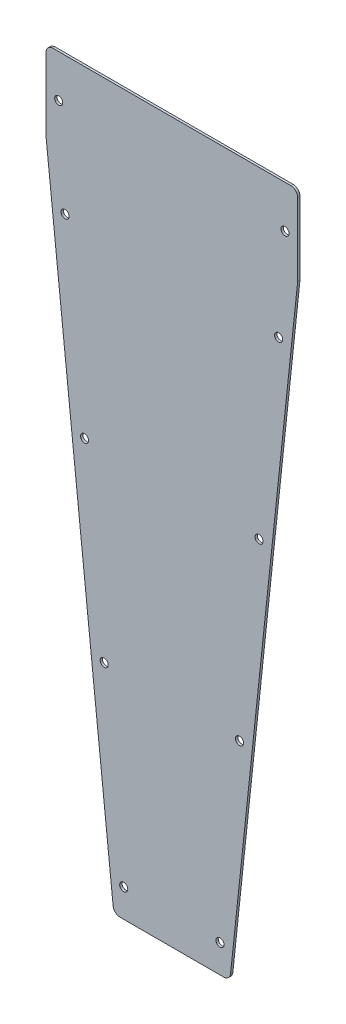
ISO-10303-21;
HEADER;
FILE_DESCRIPTION(('STEP AP214'),'2;1');
FILE_NAME('part.step','',(''),(''),'','','');
FILE_SCHEMA(('AUTOMOTIVE_DESIGN { 1 0 10303 214 1 1 1 1 }'));
ENDSEC;
DATA;
#1=APPLICATION_CONTEXT('core data for automotive mechanical design processes');
#2=APPLICATION_PROTOCOL_DEFINITION('international standard','automotive_design',2000,#1);
#3=PRODUCT_CONTEXT('',#1,'mechanical');
#4=PRODUCT('Part','Part','',(#3));
#5=PRODUCT_RELATED_PRODUCT_CATEGORY('part','',(#4));
#6=PRODUCT_DEFINITION_FORMATION('','',#4);
#7=PRODUCT_DEFINITION_CONTEXT('part definition',#1,'design');
#8=PRODUCT_DEFINITION('design','',#6,#7);
#9=PRODUCT_DEFINITION_SHAPE('','',#8);
#10=(LENGTH_UNIT() NAMED_UNIT(*) SI_UNIT(.MILLI.,.METRE.));
#11=(NAMED_UNIT(*) PLANE_ANGLE_UNIT() SI_UNIT($,.RADIAN.));
#12=(NAMED_UNIT(*) SI_UNIT($,.STERADIAN.) SOLID_ANGLE_UNIT());
#13=UNCERTAINTY_MEASURE_WITH_UNIT(LENGTH_MEASURE(1.E-05),#10,'distance_accuracy_value','');
#14=(GEOMETRIC_REPRESENTATION_CONTEXT(3) GLOBAL_UNCERTAINTY_ASSIGNED_CONTEXT((#13)) GLOBAL_UNIT_ASSIGNED_CONTEXT((#10,
#11,#12)) REPRESENTATION_CONTEXT('',''));
#15=CARTESIAN_POINT('',(0.,0.,0.));
#16=DIRECTION('',(0.,0.,1.));
#17=DIRECTION('',(1.,0.,0.));
#18=AXIS2_PLACEMENT_3D('',#15,#16,#17);
#19=CARTESIAN_POINT('',(109.,553.95,-2.));
#20=DIRECTION('',(1.,0.,0.));
#21=DIRECTION('',(0.,0.,-1.));
#22=AXIS2_PLACEMENT_3D('',#19,#20,#21);
#23=PLANE('',#22);
#24=DIRECTION('',(0.,1.,0.));
#25=VECTOR('',#24,1.);
#26=CARTESIAN_POINT('',(109.,553.95,0.));
#27=LINE('',#26,#25);
#28=CARTESIAN_POINT('',(109.,553.95,0.));
#29=VERTEX_POINT('',#28);
#30=CARTESIAN_POINT('',(109.,616.76,0.));
#31=VERTEX_POINT('',#30);
#32=EDGE_CURVE('E150',#29,#31,#27,.T.);
#33=ORIENTED_EDGE('',*,*,#32,.F.);
#34=DIRECTION('',(0.,0.,1.));
#35=VECTOR('',#34,1.);
#36=CARTESIAN_POINT('',(109.,553.95,-2.));
#37=LINE('',#36,#35);
#38=CARTESIAN_POINT('',(109.,553.95,-2.));
#39=VERTEX_POINT('',#38);
#40=EDGE_CURVE('E11',#39,#29,#37,.T.);
#41=ORIENTED_EDGE('',*,*,#40,.F.);
#42=DIRECTION('',(0.,1.,0.));
#43=VECTOR('',#42,1.);
#44=CARTESIAN_POINT('',(109.,553.95,-2.));
#45=LINE('',#44,#43);
#46=CARTESIAN_POINT('',(109.,616.76,-2.));
#47=VERTEX_POINT('',#46);
#48=EDGE_CURVE('E177',#39,#47,#45,.T.);
#49=ORIENTED_EDGE('',*,*,#48,.T.);
#50=DIRECTION('',(0.,0.,1.));
#51=VECTOR('',#50,1.);
#52=CARTESIAN_POINT('',(109.,616.76,-2.));
#53=LINE('',#52,#51);
#54=EDGE_CURVE('E44',#47,#31,#53,.T.);
#55=ORIENTED_EDGE('',*,*,#54,.T.);
#56=EDGE_LOOP('',(#33,#41,#49,#55));
#57=FACE_BOUND('',#56,.T.);
#58=ADVANCED_FACE('F41',(#57),#23,.T.);
#59=CARTESIAN_POINT('',(50.8415635198265,5.36744979339561,-2.));
#60=DIRECTION('',(0.994427253304421,-0.105425034434065,0.));
#61=DIRECTION('',(0.105425034434065,0.994427253304421,0.));
#62=AXIS2_PLACEMENT_3D('',#59,#60,#61);
#63=PLANE('',#62);
#64=DIRECTION('',(0.105425034434065,0.994427253304421,0.));
#65=VECTOR('',#64,1.);
#66=CARTESIAN_POINT('',(50.8415635198265,5.36744979339561,0.));
#67=LINE('',#66,#65);
#68=CARTESIAN_POINT('',(50.8415635198265,5.36744979339561,0.));
#69=VERTEX_POINT('',#68);
#70=EDGE_CURVE('E175',#69,#29,#67,.T.);
#71=ORIENTED_EDGE('',*,*,#70,.F.);
#72=DIRECTION('',(0.,0.,1.));
#73=VECTOR('',#72,1.);
#74=CARTESIAN_POINT('',(50.8415635198265,5.36744979339561,-2.));
#75=LINE('',#74,#73);
#76=CARTESIAN_POINT('',(50.8415635198265,5.36744979339561,-2.));
#77=VERTEX_POINT('',#76);
#78=EDGE_CURVE('E50',#77,#69,#75,.T.);
#79=ORIENTED_EDGE('',*,*,#78,.F.);
#80=DIRECTION('',(0.105425034434065,0.994427253304421,0.));
#81=VECTOR('',#80,1.);
#82=CARTESIAN_POINT('',(50.8415635198265,5.36744979339561,-2.));
#83=LINE('',#82,#81);
#84=EDGE_CURVE('E140',#77,#39,#83,.T.);
#85=ORIENTED_EDGE('',*,*,#84,.T.);
#86=ORIENTED_EDGE('',*,*,#40,.T.);
#87=EDGE_LOOP('',(#71,#79,#85,#86));
#88=FACE_BOUND('',#87,.T.);
#89=ADVANCED_FACE('F193',(#88),#63,.T.);
#90=CARTESIAN_POINT('',(44.8749999999999,5.99999999999994,-2.));
#91=DIRECTION('',(0.,0.,1.));
#92=DIRECTION('',(1.,0.,0.));
#93=AXIS2_PLACEMENT_3D('',#90,#91,#92);
#94=CYLINDRICAL_SURFACE('',#93,6.);
#95=CARTESIAN_POINT('',(44.8749999999999,5.99999999999994,0.));
#96=DIRECTION('',(0.,0.,1.));
#97=DIRECTION('',(1.,0.,0.));
#98=AXIS2_PLACEMENT_3D('',#95,#96,#97);
#99=CIRCLE('',#98,6.);
#100=CARTESIAN_POINT('',(44.8749999999999,0.,0.));
#101=VERTEX_POINT('',#100);
#102=EDGE_CURVE('E127',#101,#69,#99,.T.);
#103=ORIENTED_EDGE('',*,*,#102,.F.);
#104=DIRECTION('',(0.,0.,1.));
#105=VECTOR('',#104,1.);
#106=CARTESIAN_POINT('',(44.8749999999999,0.,-2.));
#107=LINE('',#106,#105);
#108=CARTESIAN_POINT('',(44.8749999999999,0.,-2.));
#109=VERTEX_POINT('',#108);
#110=EDGE_CURVE('E122',#109,#101,#107,.T.);
#111=ORIENTED_EDGE('',*,*,#110,.F.);
#112=CARTESIAN_POINT('',(44.8749999999999,5.99999999999994,-2.));
#113=DIRECTION('',(0.,0.,1.));
#114=DIRECTION('',(1.,0.,0.));
#115=AXIS2_PLACEMENT_3D('',#112,#113,#114);
#116=CIRCLE('',#115,6.);
#117=EDGE_CURVE('E125',#109,#77,#116,.T.);
#118=ORIENTED_EDGE('',*,*,#117,.T.);
#119=ORIENTED_EDGE('',*,*,#78,.T.);
#120=EDGE_LOOP('',(#103,#111,#118,#119));
#121=FACE_BOUND('',#120,.T.);
#122=ADVANCED_FACE('F124',(#121),#94,.T.);
#123=CARTESIAN_POINT('',(-44.8750000000001,0.,-2.));
#124=DIRECTION('',(0.,-1.,0.));
#125=DIRECTION('',(0.,0.,-1.));
#126=AXIS2_PLACEMENT_3D('',#123,#124,#125);
#127=PLANE('',#126);
#128=DIRECTION('',(1.,0.,0.));
#129=VECTOR('',#128,1.);
#130=CARTESIAN_POINT('',(-44.8750000000001,0.,0.));
#131=LINE('',#130,#129);
#132=CARTESIAN_POINT('',(-44.8750000000001,0.,0.));
#133=VERTEX_POINT('',#132);
#134=EDGE_CURVE('E172',#133,#101,#131,.T.);
#135=ORIENTED_EDGE('',*,*,#134,.F.);
#136=DIRECTION('',(0.,0.,1.));
#137=VECTOR('',#136,1.);
#138=CARTESIAN_POINT('',(-44.8750000000001,0.,-2.));
#139=LINE('',#138,#137);
#140=CARTESIAN_POINT('',(-44.8750000000001,0.,-2.));
#141=VERTEX_POINT('',#140);
#142=EDGE_CURVE('E132',#141,#133,#139,.T.);
#143=ORIENTED_EDGE('',*,*,#142,.F.);
#144=DIRECTION('',(1.,0.,0.));
#145=VECTOR('',#144,1.);
#146=CARTESIAN_POINT('',(-44.8750000000001,0.,-2.));
#147=LINE('',#146,#145);
#148=EDGE_CURVE('E138',#141,#109,#147,.T.);
#149=ORIENTED_EDGE('',*,*,#148,.T.);
#150=ORIENTED_EDGE('',*,*,#110,.T.);
#151=EDGE_LOOP('',(#135,#143,#149,#150));
#152=FACE_BOUND('',#151,.T.);
#153=ADVANCED_FACE('F142',(#152),#127,.T.);
#154=CARTESIAN_POINT('',(-44.8750000000001,5.99999999999994,-2.));
#155=DIRECTION('',(0.,0.,1.));
#156=DIRECTION('',(1.,0.,0.));
#157=AXIS2_PLACEMENT_3D('',#154,#155,#156);
#158=CYLINDRICAL_SURFACE('',#157,5.99999999999994);
#159=CARTESIAN_POINT('',(-44.8750000000001,5.99999999999994,0.));
#160=DIRECTION('',(0.,0.,1.));
#161=DIRECTION('',(-1.,0.,0.));
#162=AXIS2_PLACEMENT_3D('',#159,#160,#161);
#163=CIRCLE('',#162,5.99999999999994);
#164=CARTESIAN_POINT('',(-50.8415635198265,5.36744979339561,0.));
#165=VERTEX_POINT('',#164);
#166=EDGE_CURVE('E169',#165,#133,#163,.T.);
#167=ORIENTED_EDGE('',*,*,#166,.F.);
#168=DIRECTION('',(0.,0.,1.));
#169=VECTOR('',#168,1.);
#170=CARTESIAN_POINT('',(-50.8415635198265,5.36744979339561,-2.));
#171=LINE('',#170,#169);
#172=CARTESIAN_POINT('',(-50.8415635198265,5.36744979339561,-2.));
#173=VERTEX_POINT('',#172);
#174=EDGE_CURVE('E181',#173,#165,#171,.T.);
#175=ORIENTED_EDGE('',*,*,#174,.F.);
#176=CARTESIAN_POINT('',(-44.8750000000001,5.99999999999994,-2.));
#177=DIRECTION('',(0.,0.,1.));
#178=DIRECTION('',(-1.,0.,0.));
#179=AXIS2_PLACEMENT_3D('',#176,#177,#178);
#180=CIRCLE('',#179,5.99999999999994);
#181=EDGE_CURVE('E143',#173,#141,#180,.T.);
#182=ORIENTED_EDGE('',*,*,#181,.T.);
#183=ORIENTED_EDGE('',*,*,#142,.T.);
#184=EDGE_LOOP('',(#167,#175,#182,#183));
#185=FACE_BOUND('',#184,.T.);
#186=ADVANCED_FACE('F206',(#185),#158,.T.);
#187=CARTESIAN_POINT('',(-109.,553.95,-2.));
#188=DIRECTION('',(-0.994427253304421,-0.105425034434066,0.));
#189=DIRECTION('',(0.105425034434066,-0.994427253304421,0.));
#190=AXIS2_PLACEMENT_3D('',#187,#188,#189);
#191=PLANE('',#190);
#192=DIRECTION('',(0.105425034434066,-0.994427253304421,0.));
#193=VECTOR('',#192,1.);
#194=CARTESIAN_POINT('',(-109.,553.95,0.));
#195=LINE('',#194,#193);
#196=CARTESIAN_POINT('',(-109.,553.95,0.));
#197=VERTEX_POINT('',#196);
#198=EDGE_CURVE('E166',#197,#165,#195,.T.);
#199=ORIENTED_EDGE('',*,*,#198,.F.);
#200=DIRECTION('',(0.,0.,1.));
#201=VECTOR('',#200,1.);
#202=CARTESIAN_POINT('',(-109.,553.95,-2.));
#203=LINE('',#202,#201);
#204=CARTESIAN_POINT('',(-109.,553.95,-2.));
#205=VERTEX_POINT('',#204);
#206=EDGE_CURVE('E183',#205,#197,#203,.T.);
#207=ORIENTED_EDGE('',*,*,#206,.F.);
#208=DIRECTION('',(0.105425034434066,-0.994427253304421,0.));
#209=VECTOR('',#208,1.);
#210=CARTESIAN_POINT('',(-109.,553.95,-2.));
#211=LINE('',#210,#209);
#212=EDGE_CURVE('E145',#205,#173,#211,.T.);
#213=ORIENTED_EDGE('',*,*,#212,.T.);
#214=ORIENTED_EDGE('',*,*,#174,.T.);
#215=EDGE_LOOP('',(#199,#207,#213,#214));
#216=FACE_BOUND('',#215,.T.);
#217=ADVANCED_FACE('F209',(#216),#191,.T.);
#218=CARTESIAN_POINT('',(-109.,616.76,-2.));
#219=DIRECTION('',(-1.,0.,0.));
#220=DIRECTION('',(0.,0.,1.));
#221=AXIS2_PLACEMENT_3D('',#218,#219,#220);
#222=PLANE('',#221);
#223=DIRECTION('',(0.,-1.,0.));
#224=VECTOR('',#223,1.);
#225=CARTESIAN_POINT('',(-109.,616.76,0.));
#226=LINE('',#225,#224);
#227=CARTESIAN_POINT('',(-109.,616.76,0.));
#228=VERTEX_POINT('',#227);
#229=EDGE_CURVE('E163',#228,#197,#226,.T.);
#230=ORIENTED_EDGE('',*,*,#229,.F.);
#231=DIRECTION('',(0.,0.,1.));
#232=VECTOR('',#231,1.);
#233=CARTESIAN_POINT('',(-109.,616.76,-2.));
#234=LINE('',#233,#232);
#235=CARTESIAN_POINT('',(-109.,616.76,-2.));
#236=VERTEX_POINT('',#235);
#237=EDGE_CURVE('E185',#236,#228,#234,.T.);
#238=ORIENTED_EDGE('',*,*,#237,.F.);
#239=DIRECTION('',(0.,-1.,0.));
#240=VECTOR('',#239,1.);
#241=CARTESIAN_POINT('',(-109.,616.76,-2.));
#242=LINE('',#241,#240);
#243=EDGE_CURVE('E349',#236,#205,#242,.T.);
#244=ORIENTED_EDGE('',*,*,#243,.T.);
#245=ORIENTED_EDGE('',*,*,#206,.T.);
#246=EDGE_LOOP('',(#230,#238,#244,#245));
#247=FACE_BOUND('',#246,.T.);
#248=ADVANCED_FACE('F213',(#247),#222,.T.);
#249=CARTESIAN_POINT('',(-103.,616.76,-2.));
#250=DIRECTION('',(0.,0.,1.));
#251=DIRECTION('',(1.,0.,0.));
#252=AXIS2_PLACEMENT_3D('',#249,#250,#251);
#253=CYLINDRICAL_SURFACE('',#252,6.00000000000001);
#254=CARTESIAN_POINT('',(-103.,616.76,0.));
#255=DIRECTION('',(0.,0.,1.));
#256=DIRECTION('',(1.,0.,0.));
#257=AXIS2_PLACEMENT_3D('',#254,#255,#256);
#258=CIRCLE('',#257,6.00000000000001);
#259=CARTESIAN_POINT('',(-103.,622.76,0.));
#260=VERTEX_POINT('',#259);
#261=EDGE_CURVE('E160',#260,#228,#258,.T.);
#262=ORIENTED_EDGE('',*,*,#261,.F.);
#263=DIRECTION('',(0.,0.,1.));
#264=VECTOR('',#263,1.);
#265=CARTESIAN_POINT('',(-103.,622.76,-2.));
#266=LINE('',#265,#264);
#267=CARTESIAN_POINT('',(-103.,622.76,-2.));
#268=VERTEX_POINT('',#267);
#269=EDGE_CURVE('E187',#268,#260,#266,.T.);
#270=ORIENTED_EDGE('',*,*,#269,.F.);
#271=CARTESIAN_POINT('',(-103.,616.76,-2.));
#272=DIRECTION('',(0.,0.,1.));
#273=DIRECTION('',(1.,0.,0.));
#274=AXIS2_PLACEMENT_3D('',#271,#272,#273);
#275=CIRCLE('',#274,6.00000000000001);
#276=EDGE_CURVE('E346',#268,#236,#275,.T.);
#277=ORIENTED_EDGE('',*,*,#276,.T.);
#278=ORIENTED_EDGE('',*,*,#237,.T.);
#279=EDGE_LOOP('',(#262,#270,#277,#278));
#280=FACE_BOUND('',#279,.T.);
#281=ADVANCED_FACE('F217',(#280),#253,.T.);
#282=CARTESIAN_POINT('',(103.,622.76,-2.));
#283=DIRECTION('',(0.,1.,0.));
#284=DIRECTION('',(0.,0.,1.));
#285=AXIS2_PLACEMENT_3D('',#282,#283,#284);
#286=PLANE('',#285);
#287=DIRECTION('',(-1.,0.,0.));
#288=VECTOR('',#287,1.);
#289=CARTESIAN_POINT('',(103.,622.76,0.));
#290=LINE('',#289,#288);
#291=CARTESIAN_POINT('',(103.,622.76,0.));
#292=VERTEX_POINT('',#291);
#293=EDGE_CURVE('E157',#292,#260,#290,.T.);
#294=ORIENTED_EDGE('',*,*,#293,.F.);
#295=DIRECTION('',(0.,0.,1.));
#296=VECTOR('',#295,1.);
#297=CARTESIAN_POINT('',(103.,622.76,-2.));
#298=LINE('',#297,#296);
#299=CARTESIAN_POINT('',(103.,622.76,-2.));
#300=VERTEX_POINT('',#299);
#301=EDGE_CURVE('E188',#300,#292,#298,.T.);
#302=ORIENTED_EDGE('',*,*,#301,.F.);
#303=DIRECTION('',(-1.,0.,0.));
#304=VECTOR('',#303,1.);
#305=CARTESIAN_POINT('',(103.,622.76,-2.));
#306=LINE('',#305,#304);
#307=EDGE_CURVE('E343',#300,#268,#306,.T.);
#308=ORIENTED_EDGE('',*,*,#307,.T.);
#309=ORIENTED_EDGE('',*,*,#269,.T.);
#310=EDGE_LOOP('',(#294,#302,#308,#309));
#311=FACE_BOUND('',#310,.T.);
#312=ADVANCED_FACE('F221',(#311),#286,.T.);
#313=CARTESIAN_POINT('',(103.,616.76,-2.));
#314=DIRECTION('',(0.,0.,1.));
#315=DIRECTION('',(1.,0.,0.));
#316=AXIS2_PLACEMENT_3D('',#313,#314,#315);
#317=CYLINDRICAL_SURFACE('',#316,6.00000000000001);
#318=CARTESIAN_POINT('',(103.,616.76,0.));
#319=DIRECTION('',(0.,0.,1.));
#320=DIRECTION('',(1.,0.,0.));
#321=AXIS2_PLACEMENT_3D('',#318,#319,#320);
#322=CIRCLE('',#321,6.00000000000001);
#323=EDGE_CURVE('E153',#31,#292,#322,.T.);
#324=ORIENTED_EDGE('',*,*,#323,.F.);
#325=ORIENTED_EDGE('',*,*,#54,.F.);
#326=CARTESIAN_POINT('',(103.,616.76,-2.));
#327=DIRECTION('',(0.,0.,1.));
#328=DIRECTION('',(1.,0.,0.));
#329=AXIS2_PLACEMENT_3D('',#326,#327,#328);
#330=CIRCLE('',#329,6.00000000000001);
#331=EDGE_CURVE('E341',#47,#300,#330,.T.);
#332=ORIENTED_EDGE('',*,*,#331,.T.);
#333=ORIENTED_EDGE('',*,*,#301,.T.);
#334=EDGE_LOOP('',(#324,#325,#332,#333));
#335=FACE_BOUND('',#334,.T.);
#336=ADVANCED_FACE('F190',(#335),#317,.T.);
#337=CARTESIAN_POINT('',(103.,616.76,-2.));
#338=DIRECTION('',(0.,0.,1.));
#339=DIRECTION('',(1.,0.,0.));
#340=AXIS2_PLACEMENT_3D('',#337,#338,#339);
#341=PLANE('',#340);
#342=CARTESIAN_POINT('',(75.5618502303111,343.87,-2.));
#343=DIRECTION('',(0.,0.,1.));
#344=DIRECTION('',(-1.,0.,0.));
#345=AXIS2_PLACEMENT_3D('',#342,#343,#344);
#346=CIRCLE('',#345,3.50000000000001);
#347=CARTESIAN_POINT('',(72.0618502303111,343.87,-2.));
#348=VERTEX_POINT('',#347);
#349=EDGE_CURVE('E280',#348,#348,#346,.T.);
#350=ORIENTED_EDGE('',*,*,#349,.T.);
#351=EDGE_LOOP('',(#350));
#352=FACE_BOUND('',#351,.T.);
#353=CARTESIAN_POINT('',(58.6237004606223,184.1,-2.));
#354=DIRECTION('',(0.,0.,1.));
#355=DIRECTION('',(-1.,0.,0.));
#356=AXIS2_PLACEMENT_3D('',#353,#354,#355);
#357=CIRCLE('',#356,3.5);
#358=CARTESIAN_POINT('',(55.1237004606222,184.1,-2.));
#359=VERTEX_POINT('',#358);
#360=EDGE_CURVE('E288',#359,#359,#357,.T.);
#361=ORIENTED_EDGE('',*,*,#360,.T.);
#362=EDGE_LOOP('',(#361));
#363=FACE_BOUND('',#362,.T.);
#364=CARTESIAN_POINT('',(41.6855506909334,24.3299999999999,-2.));
#365=DIRECTION('',(0.,0.,1.));
#366=DIRECTION('',(-1.,0.,0.));
#367=AXIS2_PLACEMENT_3D('',#364,#365,#366);
#368=CIRCLE('',#367,3.5);
#369=CARTESIAN_POINT('',(38.1855506909334,24.3299999999999,-2.));
#370=VERTEX_POINT('',#369);
#371=EDGE_CURVE('E294',#370,#370,#368,.T.);
#372=ORIENTED_EDGE('',*,*,#371,.T.);
#373=EDGE_LOOP('',(#372));
#374=FACE_BOUND('',#373,.T.);
#375=CARTESIAN_POINT('',(-41.6855506909334,24.3299999999999,-2.));
#376=DIRECTION('',(0.,0.,1.));
#377=DIRECTION('',(1.,0.,0.));
#378=AXIS2_PLACEMENT_3D('',#375,#376,#377);
#379=CIRCLE('',#378,3.5);
#380=CARTESIAN_POINT('',(-38.1855506909334,24.3299999999999,-2.));
#381=VERTEX_POINT('',#380);
#382=EDGE_CURVE('E300',#381,#381,#379,.T.);
#383=ORIENTED_EDGE('',*,*,#382,.T.);
#384=EDGE_LOOP('',(#383));
#385=FACE_BOUND('',#384,.T.);
#386=CARTESIAN_POINT('',(-58.6237004606223,184.1,-2.));
#387=DIRECTION('',(0.,0.,1.));
#388=DIRECTION('',(1.,0.,0.));
#389=AXIS2_PLACEMENT_3D('',#386,#387,#388);
#390=CIRCLE('',#389,3.5);
#391=CARTESIAN_POINT('',(-55.1237004606223,184.1,-2.));
#392=VERTEX_POINT('',#391);
#393=EDGE_CURVE('E306',#392,#392,#390,.T.);
#394=ORIENTED_EDGE('',*,*,#393,.T.);
#395=EDGE_LOOP('',(#394));
#396=FACE_BOUND('',#395,.T.);
#397=CARTESIAN_POINT('',(-75.5618502303112,343.87,-2.));
#398=DIRECTION('',(0.,0.,1.));
#399=DIRECTION('',(1.,0.,0.));
#400=AXIS2_PLACEMENT_3D('',#397,#398,#399);
#401=CIRCLE('',#400,3.50000000000001);
#402=CARTESIAN_POINT('',(-72.0618502303112,343.87,-2.));
#403=VERTEX_POINT('',#402);
#404=EDGE_CURVE('E312',#403,#403,#401,.T.);
#405=ORIENTED_EDGE('',*,*,#404,.T.);
#406=EDGE_LOOP('',(#405));
#407=FACE_BOUND('',#406,.T.);
#408=CARTESIAN_POINT('',(92.4999999999999,503.64,-2.));
#409=DIRECTION('',(0.,0.,1.));
#410=DIRECTION('',(1.,0.,0.));
#411=AXIS2_PLACEMENT_3D('',#408,#409,#410);
#412=CIRCLE('',#411,3.50000000000001);
#413=CARTESIAN_POINT('',(95.9999999999999,503.64,-2.));
#414=VERTEX_POINT('',#413);
#415=EDGE_CURVE('E318',#414,#414,#412,.T.);
#416=ORIENTED_EDGE('',*,*,#415,.T.);
#417=EDGE_LOOP('',(#416));
#418=FACE_BOUND('',#417,.T.);
#419=CARTESIAN_POINT('',(-92.5000000000001,503.64,-2.));
#420=DIRECTION('',(0.,0.,1.));
#421=DIRECTION('',(1.,0.,0.));
#422=AXIS2_PLACEMENT_3D('',#419,#420,#421);
#423=CIRCLE('',#422,3.50000000000001);
#424=CARTESIAN_POINT('',(-89.0000000000001,503.64,-2.));
#425=VERTEX_POINT('',#424);
#426=EDGE_CURVE('E324',#425,#425,#423,.T.);
#427=ORIENTED_EDGE('',*,*,#426,.T.);
#428=EDGE_LOOP('',(#427));
#429=FACE_BOUND('',#428,.T.);
#430=CARTESIAN_POINT('',(97.9999999999999,586.08,-2.));
#431=DIRECTION('',(0.,0.,1.));
#432=DIRECTION('',(1.,0.,0.));
#433=AXIS2_PLACEMENT_3D('',#430,#431,#432);
#434=CIRCLE('',#433,3.50000000000001);
#435=CARTESIAN_POINT('',(101.5,586.08,-2.));
#436=VERTEX_POINT('',#435);
#437=EDGE_CURVE('E330',#436,#436,#434,.T.);
#438=ORIENTED_EDGE('',*,*,#437,.T.);
#439=EDGE_LOOP('',(#438));
#440=FACE_BOUND('',#439,.T.);
#441=CARTESIAN_POINT('',(-98.0000000000001,586.08,-2.));
#442=DIRECTION('',(0.,0.,1.));
#443=DIRECTION('',(1.,0.,0.));
#444=AXIS2_PLACEMENT_3D('',#441,#442,#443);
#445=CIRCLE('',#444,3.50000000000001);
#446=CARTESIAN_POINT('',(-94.5000000000001,586.08,-2.));
#447=VERTEX_POINT('',#446);
#448=EDGE_CURVE('E154',#447,#447,#445,.T.);
#449=ORIENTED_EDGE('',*,*,#448,.T.);
#450=EDGE_LOOP('',(#449));
#451=FACE_BOUND('',#450,.T.);
#452=ORIENTED_EDGE('',*,*,#48,.F.);
#453=ORIENTED_EDGE('',*,*,#84,.F.);
#454=ORIENTED_EDGE('',*,*,#117,.F.);
#455=ORIENTED_EDGE('',*,*,#148,.F.);
#456=ORIENTED_EDGE('',*,*,#181,.F.);
#457=ORIENTED_EDGE('',*,*,#212,.F.);
#458=ORIENTED_EDGE('',*,*,#243,.F.);
#459=ORIENTED_EDGE('',*,*,#276,.F.);
#460=ORIENTED_EDGE('',*,*,#307,.F.);
#461=ORIENTED_EDGE('',*,*,#331,.F.);
#462=EDGE_LOOP('',(#452,#453,#454,#455,#456,#457,#458,#459,#460,#461));
#463=FACE_BOUND('',#462,.T.);
#464=ADVANCED_FACE('F136',(#352,#363,#374,#385,#396,#407,#418,#429,#440,#451,#463),#341,.F.);
#465=CARTESIAN_POINT('',(103.,616.76,0.));
#466=DIRECTION('',(0.,0.,1.));
#467=DIRECTION('',(1.,0.,0.));
#468=AXIS2_PLACEMENT_3D('',#465,#466,#467);
#469=PLANE('',#468);
#470=CARTESIAN_POINT('',(75.5618502303111,343.87,0.));
#471=DIRECTION('',(0.,0.,1.));
#472=DIRECTION('',(-1.,0.,0.));
#473=AXIS2_PLACEMENT_3D('',#470,#471,#472);
#474=CIRCLE('',#473,3.50000000000001);
#475=CARTESIAN_POINT('',(72.0618502303111,343.87,0.));
#476=VERTEX_POINT('',#475);
#477=EDGE_CURVE('E283',#476,#476,#474,.T.);
#478=ORIENTED_EDGE('',*,*,#477,.F.);
#479=EDGE_LOOP('',(#478));
#480=FACE_BOUND('',#479,.T.);
#481=CARTESIAN_POINT('',(58.6237004606223,184.1,0.));
#482=DIRECTION('',(0.,0.,1.));
#483=DIRECTION('',(-1.,0.,0.));
#484=AXIS2_PLACEMENT_3D('',#481,#482,#483);
#485=CIRCLE('',#484,3.5);
#486=CARTESIAN_POINT('',(55.1237004606222,184.1,0.));
#487=VERTEX_POINT('',#486);
#488=EDGE_CURVE('E285',#487,#487,#485,.T.);
#489=ORIENTED_EDGE('',*,*,#488,.F.);
#490=EDGE_LOOP('',(#489));
#491=FACE_BOUND('',#490,.T.);
#492=CARTESIAN_POINT('',(41.6855506909334,24.3299999999999,0.));
#493=DIRECTION('',(0.,0.,1.));
#494=DIRECTION('',(-1.,0.,0.));
#495=AXIS2_PLACEMENT_3D('',#492,#493,#494);
#496=CIRCLE('',#495,3.5);
#497=CARTESIAN_POINT('',(38.1855506909334,24.3299999999999,0.));
#498=VERTEX_POINT('',#497);
#499=EDGE_CURVE('E291',#498,#498,#496,.T.);
#500=ORIENTED_EDGE('',*,*,#499,.F.);
#501=EDGE_LOOP('',(#500));
#502=FACE_BOUND('',#501,.T.);
#503=CARTESIAN_POINT('',(-41.6855506909334,24.3299999999999,0.));
#504=DIRECTION('',(0.,0.,1.));
#505=DIRECTION('',(1.,0.,0.));
#506=AXIS2_PLACEMENT_3D('',#503,#504,#505);
#507=CIRCLE('',#506,3.5);
#508=CARTESIAN_POINT('',(-38.1855506909334,24.3299999999999,0.));
#509=VERTEX_POINT('',#508);
#510=EDGE_CURVE('E297',#509,#509,#507,.T.);
#511=ORIENTED_EDGE('',*,*,#510,.F.);
#512=EDGE_LOOP('',(#511));
#513=FACE_BOUND('',#512,.T.);
#514=CARTESIAN_POINT('',(-58.6237004606223,184.1,0.));
#515=DIRECTION('',(0.,0.,1.));
#516=DIRECTION('',(1.,0.,0.));
#517=AXIS2_PLACEMENT_3D('',#514,#515,#516);
#518=CIRCLE('',#517,3.5);
#519=CARTESIAN_POINT('',(-55.1237004606223,184.1,0.));
#520=VERTEX_POINT('',#519);
#521=EDGE_CURVE('E303',#520,#520,#518,.T.);
#522=ORIENTED_EDGE('',*,*,#521,.F.);
#523=EDGE_LOOP('',(#522));
#524=FACE_BOUND('',#523,.T.);
#525=CARTESIAN_POINT('',(-75.5618502303112,343.87,0.));
#526=DIRECTION('',(0.,0.,1.));
#527=DIRECTION('',(1.,0.,0.));
#528=AXIS2_PLACEMENT_3D('',#525,#526,#527);
#529=CIRCLE('',#528,3.50000000000001);
#530=CARTESIAN_POINT('',(-72.0618502303112,343.87,0.));
#531=VERTEX_POINT('',#530);
#532=EDGE_CURVE('E309',#531,#531,#529,.T.);
#533=ORIENTED_EDGE('',*,*,#532,.F.);
#534=EDGE_LOOP('',(#533));
#535=FACE_BOUND('',#534,.T.);
#536=CARTESIAN_POINT('',(92.4999999999999,503.64,0.));
#537=DIRECTION('',(0.,0.,1.));
#538=DIRECTION('',(1.,0.,0.));
#539=AXIS2_PLACEMENT_3D('',#536,#537,#538);
#540=CIRCLE('',#539,3.50000000000001);
#541=CARTESIAN_POINT('',(95.9999999999999,503.64,0.));
#542=VERTEX_POINT('',#541);
#543=EDGE_CURVE('E315',#542,#542,#540,.T.);
#544=ORIENTED_EDGE('',*,*,#543,.F.);
#545=EDGE_LOOP('',(#544));
#546=FACE_BOUND('',#545,.T.);
#547=CARTESIAN_POINT('',(-92.5000000000001,503.64,0.));
#548=DIRECTION('',(0.,0.,1.));
#549=DIRECTION('',(1.,0.,0.));
#550=AXIS2_PLACEMENT_3D('',#547,#548,#549);
#551=CIRCLE('',#550,3.50000000000001);
#552=CARTESIAN_POINT('',(-89.0000000000001,503.64,0.));
#553=VERTEX_POINT('',#552);
#554=EDGE_CURVE('E321',#553,#553,#551,.T.);
#555=ORIENTED_EDGE('',*,*,#554,.F.);
#556=EDGE_LOOP('',(#555));
#557=FACE_BOUND('',#556,.T.);
#558=CARTESIAN_POINT('',(97.9999999999999,586.08,0.));
#559=DIRECTION('',(0.,0.,1.));
#560=DIRECTION('',(1.,0.,0.));
#561=AXIS2_PLACEMENT_3D('',#558,#559,#560);
#562=CIRCLE('',#561,3.50000000000001);
#563=CARTESIAN_POINT('',(101.5,586.08,0.));
#564=VERTEX_POINT('',#563);
#565=EDGE_CURVE('E327',#564,#564,#562,.T.);
#566=ORIENTED_EDGE('',*,*,#565,.F.);
#567=EDGE_LOOP('',(#566));
#568=FACE_BOUND('',#567,.T.);
#569=CARTESIAN_POINT('',(-98.0000000000001,586.08,0.));
#570=DIRECTION('',(0.,0.,1.));
#571=DIRECTION('',(1.,0.,0.));
#572=AXIS2_PLACEMENT_3D('',#569,#570,#571);
#573=CIRCLE('',#572,3.50000000000001);
#574=CARTESIAN_POINT('',(-94.5000000000001,586.08,0.));
#575=VERTEX_POINT('',#574);
#576=EDGE_CURVE('E333',#575,#575,#573,.T.);
#577=ORIENTED_EDGE('',*,*,#576,.F.);
#578=EDGE_LOOP('',(#577));
#579=FACE_BOUND('',#578,.T.);
#580=ORIENTED_EDGE('',*,*,#32,.T.);
#581=ORIENTED_EDGE('',*,*,#323,.T.);
#582=ORIENTED_EDGE('',*,*,#293,.T.);
#583=ORIENTED_EDGE('',*,*,#261,.T.);
#584=ORIENTED_EDGE('',*,*,#229,.T.);
#585=ORIENTED_EDGE('',*,*,#198,.T.);
#586=ORIENTED_EDGE('',*,*,#166,.T.);
#587=ORIENTED_EDGE('',*,*,#134,.T.);
#588=ORIENTED_EDGE('',*,*,#102,.T.);
#589=ORIENTED_EDGE('',*,*,#70,.T.);
#590=EDGE_LOOP('',(#580,#581,#582,#583,#584,#585,#586,#587,#588,#589));
#591=FACE_BOUND('',#590,.T.);
#592=ADVANCED_FACE('F192',(#480,#491,#502,#513,#524,#535,#546,#557,#568,#579,#591),#469,.T.);
#593=CARTESIAN_POINT('',(-98.0000000000001,586.08,-2.));
#594=DIRECTION('',(0.,0.,1.));
#595=DIRECTION('',(1.,0.,0.));
#596=AXIS2_PLACEMENT_3D('',#593,#594,#595);
#597=CYLINDRICAL_SURFACE('',#596,3.50000000000001);
#598=ORIENTED_EDGE('',*,*,#448,.F.);
#599=EDGE_LOOP('',(#598));
#600=FACE_BOUND('',#599,.T.);
#601=ORIENTED_EDGE('',*,*,#576,.T.);
#602=EDGE_LOOP('',(#601));
#603=FACE_BOUND('',#602,.T.);
#604=ADVANCED_FACE('F233',(#600,#603),#597,.F.);
#605=CARTESIAN_POINT('',(97.9999999999999,586.08,-2.));
#606=DIRECTION('',(0.,0.,1.));
#607=DIRECTION('',(1.,0.,0.));
#608=AXIS2_PLACEMENT_3D('',#605,#606,#607);
#609=CYLINDRICAL_SURFACE('',#608,3.50000000000001);
#610=ORIENTED_EDGE('',*,*,#437,.F.);
#611=EDGE_LOOP('',(#610));
#612=FACE_BOUND('',#611,.T.);
#613=ORIENTED_EDGE('',*,*,#565,.T.);
#614=EDGE_LOOP('',(#613));
#615=FACE_BOUND('',#614,.T.);
#616=ADVANCED_FACE('F240',(#612,#615),#609,.F.);
#617=CARTESIAN_POINT('',(-92.5000000000001,503.64,-2.));
#618=DIRECTION('',(0.,0.,1.));
#619=DIRECTION('',(1.,0.,0.));
#620=AXIS2_PLACEMENT_3D('',#617,#618,#619);
#621=CYLINDRICAL_SURFACE('',#620,3.50000000000001);
#622=ORIENTED_EDGE('',*,*,#426,.F.);
#623=EDGE_LOOP('',(#622));
#624=FACE_BOUND('',#623,.T.);
#625=ORIENTED_EDGE('',*,*,#554,.T.);
#626=EDGE_LOOP('',(#625));
#627=FACE_BOUND('',#626,.T.);
#628=ADVANCED_FACE('F244',(#624,#627),#621,.F.);
#629=CARTESIAN_POINT('',(92.4999999999999,503.64,-2.));
#630=DIRECTION('',(0.,0.,1.));
#631=DIRECTION('',(1.,0.,0.));
#632=AXIS2_PLACEMENT_3D('',#629,#630,#631);
#633=CYLINDRICAL_SURFACE('',#632,3.50000000000001);
#634=ORIENTED_EDGE('',*,*,#415,.F.);
#635=EDGE_LOOP('',(#634));
#636=FACE_BOUND('',#635,.T.);
#637=ORIENTED_EDGE('',*,*,#543,.T.);
#638=EDGE_LOOP('',(#637));
#639=FACE_BOUND('',#638,.T.);
#640=ADVANCED_FACE('F248',(#636,#639),#633,.F.);
#641=CARTESIAN_POINT('',(-75.5618502303112,343.87,-2.));
#642=DIRECTION('',(0.,0.,1.));
#643=DIRECTION('',(1.,0.,0.));
#644=AXIS2_PLACEMENT_3D('',#641,#642,#643);
#645=CYLINDRICAL_SURFACE('',#644,3.50000000000001);
#646=ORIENTED_EDGE('',*,*,#404,.F.);
#647=EDGE_LOOP('',(#646));
#648=FACE_BOUND('',#647,.T.);
#649=ORIENTED_EDGE('',*,*,#532,.T.);
#650=EDGE_LOOP('',(#649));
#651=FACE_BOUND('',#650,.T.);
#652=ADVANCED_FACE('F252',(#648,#651),#645,.F.);
#653=CARTESIAN_POINT('',(-58.6237004606223,184.1,-2.));
#654=DIRECTION('',(0.,0.,1.));
#655=DIRECTION('',(1.,0.,0.));
#656=AXIS2_PLACEMENT_3D('',#653,#654,#655);
#657=CYLINDRICAL_SURFACE('',#656,3.5);
#658=ORIENTED_EDGE('',*,*,#393,.F.);
#659=EDGE_LOOP('',(#658));
#660=FACE_BOUND('',#659,.T.);
#661=ORIENTED_EDGE('',*,*,#521,.T.);
#662=EDGE_LOOP('',(#661));
#663=FACE_BOUND('',#662,.T.);
#664=ADVANCED_FACE('F256',(#660,#663),#657,.F.);
#665=CARTESIAN_POINT('',(-41.6855506909334,24.3299999999999,-2.));
#666=DIRECTION('',(0.,0.,1.));
#667=DIRECTION('',(1.,0.,0.));
#668=AXIS2_PLACEMENT_3D('',#665,#666,#667);
#669=CYLINDRICAL_SURFACE('',#668,3.5);
#670=ORIENTED_EDGE('',*,*,#382,.F.);
#671=EDGE_LOOP('',(#670));
#672=FACE_BOUND('',#671,.T.);
#673=ORIENTED_EDGE('',*,*,#510,.T.);
#674=EDGE_LOOP('',(#673));
#675=FACE_BOUND('',#674,.T.);
#676=ADVANCED_FACE('F260',(#672,#675),#669,.F.);
#677=CARTESIAN_POINT('',(41.6855506909334,24.3299999999999,-2.));
#678=DIRECTION('',(0.,0.,1.));
#679=DIRECTION('',(1.,0.,0.));
#680=AXIS2_PLACEMENT_3D('',#677,#678,#679);
#681=CYLINDRICAL_SURFACE('',#680,3.5);
#682=ORIENTED_EDGE('',*,*,#371,.F.);
#683=EDGE_LOOP('',(#682));
#684=FACE_BOUND('',#683,.T.);
#685=ORIENTED_EDGE('',*,*,#499,.T.);
#686=EDGE_LOOP('',(#685));
#687=FACE_BOUND('',#686,.T.);
#688=ADVANCED_FACE('F264',(#684,#687),#681,.F.);
#689=CARTESIAN_POINT('',(58.6237004606223,184.1,-2.));
#690=DIRECTION('',(0.,0.,1.));
#691=DIRECTION('',(1.,0.,0.));
#692=AXIS2_PLACEMENT_3D('',#689,#690,#691);
#693=CYLINDRICAL_SURFACE('',#692,3.5);
#694=ORIENTED_EDGE('',*,*,#360,.F.);
#695=EDGE_LOOP('',(#694));
#696=FACE_BOUND('',#695,.T.);
#697=ORIENTED_EDGE('',*,*,#488,.T.);
#698=EDGE_LOOP('',(#697));
#699=FACE_BOUND('',#698,.T.);
#700=ADVANCED_FACE('F268',(#696,#699),#693,.F.);
#701=CARTESIAN_POINT('',(75.5618502303111,343.87,-2.));
#702=DIRECTION('',(0.,0.,1.));
#703=DIRECTION('',(1.,0.,0.));
#704=AXIS2_PLACEMENT_3D('',#701,#702,#703);
#705=CYLINDRICAL_SURFACE('',#704,3.50000000000001);
#706=ORIENTED_EDGE('',*,*,#349,.F.);
#707=EDGE_LOOP('',(#706));
#708=FACE_BOUND('',#707,.T.);
#709=ORIENTED_EDGE('',*,*,#477,.T.);
#710=EDGE_LOOP('',(#709));
#711=FACE_BOUND('',#710,.T.);
#712=ADVANCED_FACE('F272',(#708,#711),#705,.F.);
#713=CLOSED_SHELL('',(#58,#89,#122,#153,#186,#217,#248,#281,#312,#336,#464,#592,#604,#616,#628,
#640,#652,#664,#676,#688,#700,#712));
#714=MANIFOLD_SOLID_BREP('B2',#713);
#715=ADVANCED_BREP_SHAPE_REPRESENTATION('',(#18,#714),#14);
#716=SHAPE_DEFINITION_REPRESENTATION(#9,#715);
ENDSEC;
END-ISO-10303-21;
